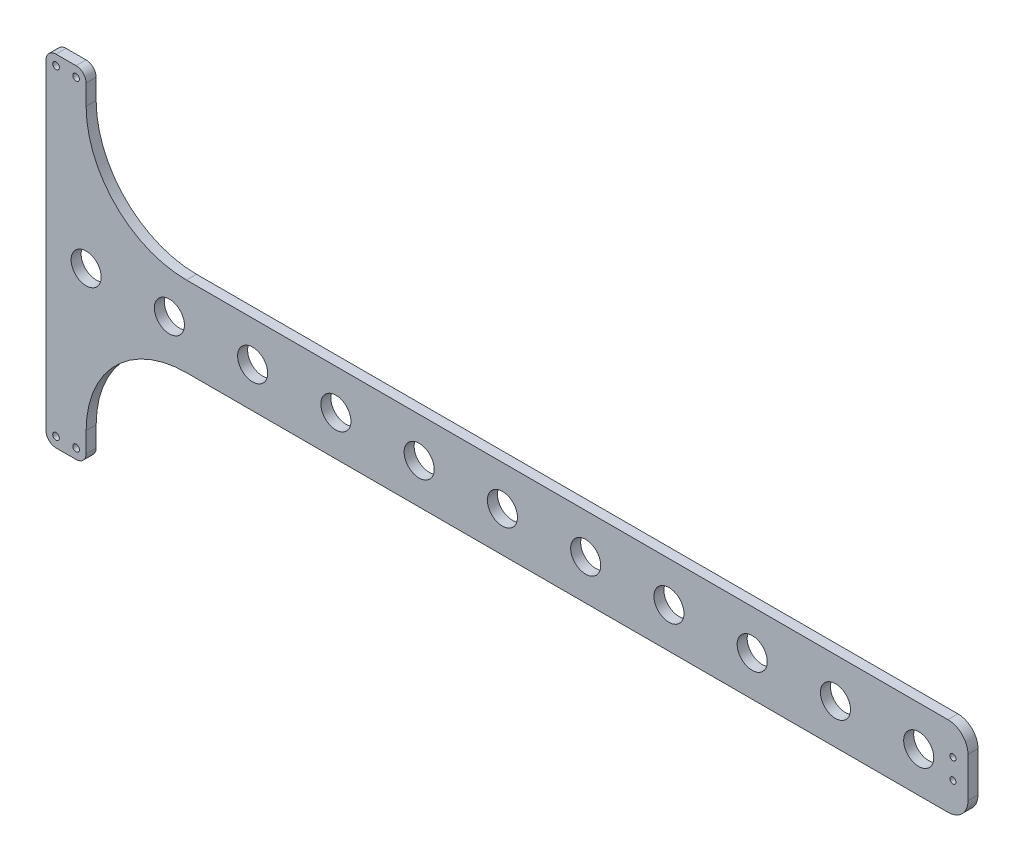
ISO-10303-21;
HEADER;
FILE_DESCRIPTION(('STEP AP214'),'2;1');
FILE_NAME('part.step','',(''),(''),'','','');
FILE_SCHEMA(('AUTOMOTIVE_DESIGN { 1 0 10303 214 1 1 1 1 }'));
ENDSEC;
DATA;
#1=APPLICATION_CONTEXT('core data for automotive mechanical design processes');
#2=APPLICATION_PROTOCOL_DEFINITION('international standard','automotive_design',2000,#1);
#3=PRODUCT_CONTEXT('',#1,'mechanical');
#4=PRODUCT('Part','Part','',(#3));
#5=PRODUCT_RELATED_PRODUCT_CATEGORY('part','',(#4));
#6=PRODUCT_DEFINITION_FORMATION('','',#4);
#7=PRODUCT_DEFINITION_CONTEXT('part definition',#1,'design');
#8=PRODUCT_DEFINITION('design','',#6,#7);
#9=PRODUCT_DEFINITION_SHAPE('','',#8);
#10=(LENGTH_UNIT() NAMED_UNIT(*) SI_UNIT(.MILLI.,.METRE.));
#11=(NAMED_UNIT(*) PLANE_ANGLE_UNIT() SI_UNIT($,.RADIAN.));
#12=(NAMED_UNIT(*) SI_UNIT($,.STERADIAN.) SOLID_ANGLE_UNIT());
#13=UNCERTAINTY_MEASURE_WITH_UNIT(LENGTH_MEASURE(1.E-05),#10,'distance_accuracy_value','');
#14=(GEOMETRIC_REPRESENTATION_CONTEXT(3) GLOBAL_UNCERTAINTY_ASSIGNED_CONTEXT((#13)) GLOBAL_UNIT_ASSIGNED_CONTEXT((#10,
#11,#12)) REPRESENTATION_CONTEXT('',''));
#15=CARTESIAN_POINT('',(0.,0.,0.));
#16=DIRECTION('',(0.,0.,1.));
#17=DIRECTION('',(1.,0.,0.));
#18=AXIS2_PLACEMENT_3D('',#15,#16,#17);
#19=CARTESIAN_POINT('',(15.,0.,5.));
#20=DIRECTION('',(1.,0.,0.));
#21=DIRECTION('',(0.,1.,0.));
#22=AXIS2_PLACEMENT_3D('',#19,#20,#21);
#23=PLANE('',#22);
#24=DIRECTION('',(0.,-1.,0.));
#25=VECTOR('',#24,1.);
#26=CARTESIAN_POINT('',(15.,0.,5.));
#27=LINE('',#26,#25);
#28=CARTESIAN_POINT('',(15.,-70.,5.));
#29=VERTEX_POINT('',#28);
#30=CARTESIAN_POINT('',(15.,-80.,5.));
#31=VERTEX_POINT('',#30);
#32=EDGE_CURVE('E295',#29,#31,#27,.T.);
#33=ORIENTED_EDGE('',*,*,#32,.T.);
#34=DIRECTION('',(0.,0.,-1.));
#35=VECTOR('',#34,1.);
#36=CARTESIAN_POINT('',(15.,-80.,0.));
#37=LINE('',#36,#35);
#38=CARTESIAN_POINT('',(15.,-80.,0.));
#39=VERTEX_POINT('',#38);
#40=EDGE_CURVE('E224',#31,#39,#37,.T.);
#41=ORIENTED_EDGE('',*,*,#40,.T.);
#42=DIRECTION('',(0.,-1.,0.));
#43=VECTOR('',#42,1.);
#44=CARTESIAN_POINT('',(15.,0.,0.));
#45=LINE('',#44,#43);
#46=CARTESIAN_POINT('',(15.,-70.,0.));
#47=VERTEX_POINT('',#46);
#48=EDGE_CURVE('E161',#47,#39,#45,.T.);
#49=ORIENTED_EDGE('',*,*,#48,.F.);
#50=DIRECTION('',(0.,0.,-1.));
#51=VECTOR('',#50,1.);
#52=CARTESIAN_POINT('',(15.,-70.,5.));
#53=LINE('',#52,#51);
#54=EDGE_CURVE('E169',#47,#29,#53,.F.);
#55=ORIENTED_EDGE('',*,*,#54,.T.);
#56=EDGE_LOOP('',(#33,#41,#49,#55));
#57=FACE_BOUND('',#56,.T.);
#58=ADVANCED_FACE('F35',(#57),#23,.T.);
#59=CARTESIAN_POINT('',(0.,-20.0000000000001,5.));
#60=DIRECTION('',(0.,-1.,0.));
#61=DIRECTION('',(1.,0.,0.));
#62=AXIS2_PLACEMENT_3D('',#59,#60,#61);
#63=PLANE('',#62);
#64=DIRECTION('',(-1.,0.,0.));
#65=VECTOR('',#64,1.);
#66=CARTESIAN_POINT('',(0.,-20.0000000000001,0.));
#67=LINE('',#66,#65);
#68=CARTESIAN_POINT('',(444.55,-20.,0.));
#69=VERTEX_POINT('',#68);
#70=CARTESIAN_POINT('',(65.,-20.0000000000001,0.));
#71=VERTEX_POINT('',#70);
#72=EDGE_CURVE('E150',#69,#71,#67,.T.);
#73=ORIENTED_EDGE('',*,*,#72,.F.);
#74=DIRECTION('',(0.,0.,-1.));
#75=VECTOR('',#74,1.);
#76=CARTESIAN_POINT('',(444.55,-20.,5.));
#77=LINE('',#76,#75);
#78=CARTESIAN_POINT('',(444.55,-20.,5.));
#79=VERTEX_POINT('',#78);
#80=EDGE_CURVE('E60',#69,#79,#77,.F.);
#81=ORIENTED_EDGE('',*,*,#80,.T.);
#82=DIRECTION('',(-1.,0.,0.));
#83=VECTOR('',#82,1.);
#84=CARTESIAN_POINT('',(0.,-20.0000000000001,5.));
#85=LINE('',#84,#83);
#86=CARTESIAN_POINT('',(65.,-20.0000000000001,5.));
#87=VERTEX_POINT('',#86);
#88=EDGE_CURVE('E174',#79,#87,#85,.T.);
#89=ORIENTED_EDGE('',*,*,#88,.T.);
#90=DIRECTION('',(0.,0.,-1.));
#91=VECTOR('',#90,1.);
#92=CARTESIAN_POINT('',(65.,-20.0000000000001,0.));
#93=LINE('',#92,#91);
#94=EDGE_CURVE('E168',#87,#71,#93,.T.);
#95=ORIENTED_EDGE('',*,*,#94,.T.);
#96=EDGE_LOOP('',(#73,#81,#89,#95));
#97=FACE_BOUND('',#96,.T.);
#98=ADVANCED_FACE('F173',(#97),#63,.T.);
#99=CARTESIAN_POINT('',(454.55,0.,5.));
#100=DIRECTION('',(1.,0.,0.));
#101=DIRECTION('',(0.,0.,-1.));
#102=AXIS2_PLACEMENT_3D('',#99,#100,#101);
#103=PLANE('',#102);
#104=DIRECTION('',(0.,-1.,0.));
#105=VECTOR('',#104,1.);
#106=CARTESIAN_POINT('',(454.55,0.,5.));
#107=LINE('',#106,#105);
#108=CARTESIAN_POINT('',(454.55,10.,5.));
#109=VERTEX_POINT('',#108);
#110=CARTESIAN_POINT('',(454.55,-10.,5.));
#111=VERTEX_POINT('',#110);
#112=EDGE_CURVE('E300',#109,#111,#107,.T.);
#113=ORIENTED_EDGE('',*,*,#112,.T.);
#114=DIRECTION('',(0.,0.,-1.));
#115=VECTOR('',#114,1.);
#116=CARTESIAN_POINT('',(454.55,-10.,5.));
#117=LINE('',#116,#115);
#118=CARTESIAN_POINT('',(454.55,-10.,0.));
#119=VERTEX_POINT('',#118);
#120=EDGE_CURVE('E243',#111,#119,#117,.T.);
#121=ORIENTED_EDGE('',*,*,#120,.T.);
#122=DIRECTION('',(0.,-1.,0.));
#123=VECTOR('',#122,1.);
#124=CARTESIAN_POINT('',(454.55,0.,0.));
#125=LINE('',#124,#123);
#126=CARTESIAN_POINT('',(454.55,10.,0.));
#127=VERTEX_POINT('',#126);
#128=EDGE_CURVE('E160',#127,#119,#125,.T.);
#129=ORIENTED_EDGE('',*,*,#128,.F.);
#130=DIRECTION('',(0.,0.,-1.));
#131=VECTOR('',#130,1.);
#132=CARTESIAN_POINT('',(454.55,10.,5.));
#133=LINE('',#132,#131);
#134=EDGE_CURVE('E234',#127,#109,#133,.F.);
#135=ORIENTED_EDGE('',*,*,#134,.T.);
#136=EDGE_LOOP('',(#113,#121,#129,#135));
#137=FACE_BOUND('',#136,.T.);
#138=ADVANCED_FACE('F369',(#137),#103,.T.);
#139=CARTESIAN_POINT('',(0.,19.9999999999999,5.));
#140=DIRECTION('',(0.,-1.,0.));
#141=DIRECTION('',(1.,0.,0.));
#142=AXIS2_PLACEMENT_3D('',#139,#140,#141);
#143=PLANE('',#142);
#144=DIRECTION('',(-1.,0.,0.));
#145=VECTOR('',#144,1.);
#146=CARTESIAN_POINT('',(0.,19.9999999999999,5.));
#147=LINE('',#146,#145);
#148=CARTESIAN_POINT('',(444.55,20.,5.));
#149=VERTEX_POINT('',#148);
#150=CARTESIAN_POINT('',(65.,19.9999999999999,5.));
#151=VERTEX_POINT('',#150);
#152=EDGE_CURVE('E303',#149,#151,#147,.T.);
#153=ORIENTED_EDGE('',*,*,#152,.F.);
#154=DIRECTION('',(0.,0.,-1.));
#155=VECTOR('',#154,1.);
#156=CARTESIAN_POINT('',(444.55,20.,0.));
#157=LINE('',#156,#155);
#158=CARTESIAN_POINT('',(444.55,20.,0.));
#159=VERTEX_POINT('',#158);
#160=EDGE_CURVE('E11',#149,#159,#157,.T.);
#161=ORIENTED_EDGE('',*,*,#160,.T.);
#162=DIRECTION('',(-1.,0.,0.));
#163=VECTOR('',#162,1.);
#164=CARTESIAN_POINT('',(0.,19.9999999999999,0.));
#165=LINE('',#164,#163);
#166=CARTESIAN_POINT('',(65.,19.9999999999999,0.));
#167=VERTEX_POINT('',#166);
#168=EDGE_CURVE('E325',#159,#167,#165,.T.);
#169=ORIENTED_EDGE('',*,*,#168,.T.);
#170=DIRECTION('',(0.,0.,-1.));
#171=VECTOR('',#170,1.);
#172=CARTESIAN_POINT('',(65.,19.9999999999999,5.));
#173=LINE('',#172,#171);
#174=EDGE_CURVE('E171',#167,#151,#173,.F.);
#175=ORIENTED_EDGE('',*,*,#174,.T.);
#176=EDGE_LOOP('',(#153,#161,#169,#175));
#177=FACE_BOUND('',#176,.T.);
#178=ADVANCED_FACE('F375',(#177),#143,.F.);
#179=CARTESIAN_POINT('',(15.,80.,0.));
#180=VERTEX_POINT('',#179);
#181=CARTESIAN_POINT('',(15.,70.,0.));
#182=VERTEX_POINT('',#181);
#183=EDGE_CURVE('E322',#180,#182,#45,.T.);
#184=ORIENTED_EDGE('',*,*,#183,.F.);
#185=DIRECTION('',(0.,0.,-1.));
#186=VECTOR('',#185,1.);
#187=CARTESIAN_POINT('',(15.,80.,5.));
#188=LINE('',#187,#186);
#189=CARTESIAN_POINT('',(15.,80.,5.));
#190=VERTEX_POINT('',#189);
#191=EDGE_CURVE('E232',#180,#190,#188,.F.);
#192=ORIENTED_EDGE('',*,*,#191,.T.);
#193=CARTESIAN_POINT('',(15.,70.,5.));
#194=VERTEX_POINT('',#193);
#195=EDGE_CURVE('E298',#190,#194,#27,.T.);
#196=ORIENTED_EDGE('',*,*,#195,.T.);
#197=DIRECTION('',(0.,0.,-1.));
#198=VECTOR('',#197,1.);
#199=CARTESIAN_POINT('',(15.,70.,5.));
#200=LINE('',#199,#198);
#201=EDGE_CURVE('E178',#194,#182,#200,.T.);
#202=ORIENTED_EDGE('',*,*,#201,.T.);
#203=EDGE_LOOP('',(#184,#192,#196,#202));
#204=FACE_BOUND('',#203,.T.);
#205=ADVANCED_FACE('F365',(#204),#23,.T.);
#206=CARTESIAN_POINT('',(0.,85.,5.));
#207=DIRECTION('',(0.,1.,0.));
#208=DIRECTION('',(0.,0.,1.));
#209=AXIS2_PLACEMENT_3D('',#206,#207,#208);
#210=PLANE('',#209);
#211=DIRECTION('',(1.,0.,0.));
#212=VECTOR('',#211,1.);
#213=CARTESIAN_POINT('',(0.,85.,0.));
#214=LINE('',#213,#212);
#215=CARTESIAN_POINT('',(0.,85.,0.));
#216=VERTEX_POINT('',#215);
#217=CARTESIAN_POINT('',(9.99999999999998,85.,0.));
#218=VERTEX_POINT('',#217);
#219=EDGE_CURVE('E327',#216,#218,#214,.T.);
#220=ORIENTED_EDGE('',*,*,#219,.F.);
#221=DIRECTION('',(0.,0.,-1.));
#222=VECTOR('',#221,1.);
#223=CARTESIAN_POINT('',(0.,85.,5.));
#224=LINE('',#223,#222);
#225=CARTESIAN_POINT('',(0.,85.,5.));
#226=VERTEX_POINT('',#225);
#227=EDGE_CURVE('E230',#216,#226,#224,.F.);
#228=ORIENTED_EDGE('',*,*,#227,.T.);
#229=DIRECTION('',(1.,0.,0.));
#230=VECTOR('',#229,1.);
#231=CARTESIAN_POINT('',(0.,85.,5.));
#232=LINE('',#231,#230);
#233=CARTESIAN_POINT('',(9.99999999999998,85.,5.));
#234=VERTEX_POINT('',#233);
#235=EDGE_CURVE('E305',#226,#234,#232,.T.);
#236=ORIENTED_EDGE('',*,*,#235,.T.);
#237=DIRECTION('',(0.,0.,-1.));
#238=VECTOR('',#237,1.);
#239=CARTESIAN_POINT('',(9.99999999999998,85.,5.));
#240=LINE('',#239,#238);
#241=EDGE_CURVE('E227',#234,#218,#240,.T.);
#242=ORIENTED_EDGE('',*,*,#241,.T.);
#243=EDGE_LOOP('',(#220,#228,#236,#242));
#244=FACE_BOUND('',#243,.T.);
#245=ADVANCED_FACE('F374',(#244),#210,.T.);
#246=CARTESIAN_POINT('',(-4.99999999999999,0.,5.));
#247=DIRECTION('',(1.,0.,0.));
#248=DIRECTION('',(0.,1.,0.));
#249=AXIS2_PLACEMENT_3D('',#246,#247,#248);
#250=PLANE('',#249);
#251=DIRECTION('',(0.,-1.,0.));
#252=VECTOR('',#251,1.);
#253=CARTESIAN_POINT('',(-4.99999999999999,0.,0.));
#254=LINE('',#253,#252);
#255=CARTESIAN_POINT('',(-5.,80.,0.));
#256=VERTEX_POINT('',#255);
#257=CARTESIAN_POINT('',(-4.99999999999998,-80.,0.));
#258=VERTEX_POINT('',#257);
#259=EDGE_CURVE('E330',#256,#258,#254,.T.);
#260=ORIENTED_EDGE('',*,*,#259,.T.);
#261=DIRECTION('',(0.,0.,-1.));
#262=VECTOR('',#261,1.);
#263=CARTESIAN_POINT('',(-4.99999999999998,-80.,5.));
#264=LINE('',#263,#262);
#265=CARTESIAN_POINT('',(-4.99999999999998,-80.,5.));
#266=VERTEX_POINT('',#265);
#267=EDGE_CURVE('E214',#258,#266,#264,.F.);
#268=ORIENTED_EDGE('',*,*,#267,.T.);
#269=DIRECTION('',(0.,-1.,0.));
#270=VECTOR('',#269,1.);
#271=CARTESIAN_POINT('',(-4.99999999999999,0.,5.));
#272=LINE('',#271,#270);
#273=CARTESIAN_POINT('',(-5.,80.,5.));
#274=VERTEX_POINT('',#273);
#275=EDGE_CURVE('E308',#274,#266,#272,.T.);
#276=ORIENTED_EDGE('',*,*,#275,.F.);
#277=DIRECTION('',(0.,0.,-1.));
#278=VECTOR('',#277,1.);
#279=CARTESIAN_POINT('',(-5.,80.,0.));
#280=LINE('',#279,#278);
#281=EDGE_CURVE('E211',#274,#256,#280,.T.);
#282=ORIENTED_EDGE('',*,*,#281,.T.);
#283=EDGE_LOOP('',(#260,#268,#276,#282));
#284=FACE_BOUND('',#283,.T.);
#285=ADVANCED_FACE('F381',(#284),#250,.F.);
#286=CARTESIAN_POINT('',(0.,80.,5.));
#287=DIRECTION('',(0.,0.,-1.));
#288=DIRECTION('',(-1.,0.,0.));
#289=AXIS2_PLACEMENT_3D('',#286,#287,#288);
#290=CYLINDRICAL_SURFACE('',#289,1.65);
#291=CARTESIAN_POINT('',(0.,80.,5.));
#292=DIRECTION('',(0.,0.,1.));
#293=DIRECTION('',(1.,0.,0.));
#294=AXIS2_PLACEMENT_3D('',#291,#292,#293);
#295=CIRCLE('',#294,1.65);
#296=CARTESIAN_POINT('',(1.65,80.,5.));
#297=VERTEX_POINT('',#296);
#298=EDGE_CURVE('E181',#297,#297,#295,.T.);
#299=ORIENTED_EDGE('',*,*,#298,.T.);
#300=EDGE_LOOP('',(#299));
#301=FACE_BOUND('',#300,.T.);
#302=CARTESIAN_POINT('',(0.,80.,0.));
#303=DIRECTION('',(0.,0.,1.));
#304=DIRECTION('',(1.,0.,0.));
#305=AXIS2_PLACEMENT_3D('',#302,#303,#304);
#306=CIRCLE('',#305,1.65);
#307=CARTESIAN_POINT('',(1.65,80.,0.));
#308=VERTEX_POINT('',#307);
#309=EDGE_CURVE('E341',#308,#308,#306,.T.);
#310=ORIENTED_EDGE('',*,*,#309,.F.);
#311=EDGE_LOOP('',(#310));
#312=FACE_BOUND('',#311,.T.);
#313=ADVANCED_FACE('F740',(#301,#312),#290,.F.);
#314=CARTESIAN_POINT('',(10.,80.,5.));
#315=DIRECTION('',(0.,0.,-1.));
#316=DIRECTION('',(-1.,0.,0.));
#317=AXIS2_PLACEMENT_3D('',#314,#315,#316);
#318=CYLINDRICAL_SURFACE('',#317,1.65);
#319=CARTESIAN_POINT('',(10.,80.,5.));
#320=DIRECTION('',(0.,0.,1.));
#321=DIRECTION('',(1.,0.,0.));
#322=AXIS2_PLACEMENT_3D('',#319,#320,#321);
#323=CIRCLE('',#322,1.65);
#324=CARTESIAN_POINT('',(11.65,80.,5.));
#325=VERTEX_POINT('',#324);
#326=EDGE_CURVE('E317',#325,#325,#323,.T.);
#327=ORIENTED_EDGE('',*,*,#326,.T.);
#328=EDGE_LOOP('',(#327));
#329=FACE_BOUND('',#328,.T.);
#330=CARTESIAN_POINT('',(10.,80.,0.));
#331=DIRECTION('',(0.,0.,1.));
#332=DIRECTION('',(1.,0.,0.));
#333=AXIS2_PLACEMENT_3D('',#330,#331,#332);
#334=CIRCLE('',#333,1.65);
#335=CARTESIAN_POINT('',(11.65,80.,0.));
#336=VERTEX_POINT('',#335);
#337=EDGE_CURVE('E339',#336,#336,#334,.T.);
#338=ORIENTED_EDGE('',*,*,#337,.F.);
#339=EDGE_LOOP('',(#338));
#340=FACE_BOUND('',#339,.T.);
#341=ADVANCED_FACE('F748',(#329,#340),#318,.F.);
#342=CARTESIAN_POINT('',(10.,-80.,5.));
#343=DIRECTION('',(0.,0.,-1.));
#344=DIRECTION('',(-1.,0.,0.));
#345=AXIS2_PLACEMENT_3D('',#342,#343,#344);
#346=CYLINDRICAL_SURFACE('',#345,1.65);
#347=CARTESIAN_POINT('',(10.,-80.,5.));
#348=DIRECTION('',(0.,0.,1.));
#349=DIRECTION('',(1.,0.,0.));
#350=AXIS2_PLACEMENT_3D('',#347,#348,#349);
#351=CIRCLE('',#350,1.65);
#352=CARTESIAN_POINT('',(11.65,-80.,5.));
#353=VERTEX_POINT('',#352);
#354=EDGE_CURVE('E314',#353,#353,#351,.F.);
#355=ORIENTED_EDGE('',*,*,#354,.F.);
#356=EDGE_LOOP('',(#355));
#357=FACE_BOUND('',#356,.T.);
#358=CARTESIAN_POINT('',(10.,-80.,0.));
#359=DIRECTION('',(0.,0.,1.));
#360=DIRECTION('',(1.,0.,0.));
#361=AXIS2_PLACEMENT_3D('',#358,#359,#360);
#362=CIRCLE('',#361,1.65);
#363=CARTESIAN_POINT('',(11.65,-80.,0.));
#364=VERTEX_POINT('',#363);
#365=EDGE_CURVE('E336',#364,#364,#362,.F.);
#366=ORIENTED_EDGE('',*,*,#365,.T.);
#367=EDGE_LOOP('',(#366));
#368=FACE_BOUND('',#367,.T.);
#369=ADVANCED_FACE('F757',(#357,#368),#346,.F.);
#370=CARTESIAN_POINT('',(0.,-85.,5.));
#371=DIRECTION('',(0.,1.,0.));
#372=DIRECTION('',(0.,0.,1.));
#373=AXIS2_PLACEMENT_3D('',#370,#371,#372);
#374=PLANE('',#373);
#375=DIRECTION('',(1.,0.,0.));
#376=VECTOR('',#375,1.);
#377=CARTESIAN_POINT('',(0.,-85.,5.));
#378=LINE('',#377,#376);
#379=CARTESIAN_POINT('',(0.,-85.,5.));
#380=VERTEX_POINT('',#379);
#381=CARTESIAN_POINT('',(10.,-85.,5.));
#382=VERTEX_POINT('',#381);
#383=EDGE_CURVE('E311',#380,#382,#378,.T.);
#384=ORIENTED_EDGE('',*,*,#383,.F.);
#385=DIRECTION('',(0.,0.,-1.));
#386=VECTOR('',#385,1.);
#387=CARTESIAN_POINT('',(0.,-85.,5.));
#388=LINE('',#387,#386);
#389=CARTESIAN_POINT('',(0.,-85.,0.));
#390=VERTEX_POINT('',#389);
#391=EDGE_CURVE('E200',#380,#390,#388,.T.);
#392=ORIENTED_EDGE('',*,*,#391,.T.);
#393=DIRECTION('',(1.,0.,0.));
#394=VECTOR('',#393,1.);
#395=CARTESIAN_POINT('',(0.,-85.,0.));
#396=LINE('',#395,#394);
#397=CARTESIAN_POINT('',(10.,-85.,0.));
#398=VERTEX_POINT('',#397);
#399=EDGE_CURVE('E333',#390,#398,#396,.T.);
#400=ORIENTED_EDGE('',*,*,#399,.T.);
#401=DIRECTION('',(0.,0.,-1.));
#402=VECTOR('',#401,1.);
#403=CARTESIAN_POINT('',(10.,-85.,5.));
#404=LINE('',#403,#402);
#405=EDGE_CURVE('E198',#398,#382,#404,.F.);
#406=ORIENTED_EDGE('',*,*,#405,.T.);
#407=EDGE_LOOP('',(#384,#392,#400,#406));
#408=FACE_BOUND('',#407,.T.);
#409=ADVANCED_FACE('F412',(#408),#374,.F.);
#410=CARTESIAN_POINT('',(0.,-80.,5.));
#411=DIRECTION('',(0.,0.,-1.));
#412=DIRECTION('',(-1.,0.,0.));
#413=AXIS2_PLACEMENT_3D('',#410,#411,#412);
#414=CYLINDRICAL_SURFACE('',#413,1.65);
#415=CARTESIAN_POINT('',(0.,-80.,5.));
#416=DIRECTION('',(0.,0.,1.));
#417=DIRECTION('',(1.,0.,0.));
#418=AXIS2_PLACEMENT_3D('',#415,#416,#417);
#419=CIRCLE('',#418,1.65);
#420=CARTESIAN_POINT('',(1.65,-80.,5.));
#421=VERTEX_POINT('',#420);
#422=EDGE_CURVE('E176',#421,#421,#419,.F.);
#423=ORIENTED_EDGE('',*,*,#422,.F.);
#424=EDGE_LOOP('',(#423));
#425=FACE_BOUND('',#424,.T.);
#426=CARTESIAN_POINT('',(0.,-80.,0.));
#427=DIRECTION('',(0.,0.,1.));
#428=DIRECTION('',(1.,0.,0.));
#429=AXIS2_PLACEMENT_3D('',#426,#427,#428);
#430=CIRCLE('',#429,1.65);
#431=CARTESIAN_POINT('',(1.65,-80.,0.));
#432=VERTEX_POINT('',#431);
#433=EDGE_CURVE('E184',#432,#432,#430,.F.);
#434=ORIENTED_EDGE('',*,*,#433,.T.);
#435=EDGE_LOOP('',(#434));
#436=FACE_BOUND('',#435,.T.);
#437=ADVANCED_FACE('F348',(#425,#436),#414,.F.);
#438=CARTESIAN_POINT('',(0.,0.,5.));
#439=DIRECTION('',(0.,0.,1.));
#440=DIRECTION('',(1.,0.,0.));
#441=AXIS2_PLACEMENT_3D('',#438,#439,#440);
#442=PLANE('',#441);
#443=CARTESIAN_POINT('',(15.,0.,5.));
#444=DIRECTION('',(0.,0.,1.));
#445=DIRECTION('',(1.,0.,0.));
#446=AXIS2_PLACEMENT_3D('',#443,#444,#445);
#447=CIRCLE('',#446,7.5);
#448=CARTESIAN_POINT('',(22.5,0.,5.));
#449=VERTEX_POINT('',#448);
#450=EDGE_CURVE('E256',#449,#449,#447,.T.);
#451=ORIENTED_EDGE('',*,*,#450,.F.);
#452=EDGE_LOOP('',(#451));
#453=FACE_BOUND('',#452,.T.);
#454=CARTESIAN_POINT('',(56.5,0.,5.));
#455=DIRECTION('',(0.,0.,1.));
#456=DIRECTION('',(1.,0.,0.));
#457=AXIS2_PLACEMENT_3D('',#454,#455,#456);
#458=CIRCLE('',#457,7.50000000000002);
#459=CARTESIAN_POINT('',(64.,0.,5.));
#460=VERTEX_POINT('',#459);
#461=EDGE_CURVE('E507',#460,#460,#458,.T.);
#462=ORIENTED_EDGE('',*,*,#461,.F.);
#463=EDGE_LOOP('',(#462));
#464=FACE_BOUND('',#463,.T.);
#465=CARTESIAN_POINT('',(98.,0.,5.));
#466=DIRECTION('',(0.,0.,1.));
#467=DIRECTION('',(1.,0.,0.));
#468=AXIS2_PLACEMENT_3D('',#465,#466,#467);
#469=CIRCLE('',#468,7.5);
#470=CARTESIAN_POINT('',(105.5,0.,5.));
#471=VERTEX_POINT('',#470);
#472=EDGE_CURVE('E510',#471,#471,#469,.T.);
#473=ORIENTED_EDGE('',*,*,#472,.F.);
#474=EDGE_LOOP('',(#473));
#475=FACE_BOUND('',#474,.T.);
#476=CARTESIAN_POINT('',(139.5,0.,5.));
#477=DIRECTION('',(0.,0.,1.));
#478=DIRECTION('',(1.,0.,0.));
#479=AXIS2_PLACEMENT_3D('',#476,#477,#478);
#480=CIRCLE('',#479,7.50000000000001);
#481=CARTESIAN_POINT('',(147.,0.,5.));
#482=VERTEX_POINT('',#481);
#483=EDGE_CURVE('E515',#482,#482,#480,.T.);
#484=ORIENTED_EDGE('',*,*,#483,.F.);
#485=EDGE_LOOP('',(#484));
#486=FACE_BOUND('',#485,.T.);
#487=CARTESIAN_POINT('',(181.,0.,5.));
#488=DIRECTION('',(0.,0.,1.));
#489=DIRECTION('',(1.,0.,0.));
#490=AXIS2_PLACEMENT_3D('',#487,#488,#489);
#491=CIRCLE('',#490,7.49999999999998);
#492=CARTESIAN_POINT('',(188.5,0.,5.));
#493=VERTEX_POINT('',#492);
#494=EDGE_CURVE('E518',#493,#493,#491,.T.);
#495=ORIENTED_EDGE('',*,*,#494,.F.);
#496=EDGE_LOOP('',(#495));
#497=FACE_BOUND('',#496,.T.);
#498=CARTESIAN_POINT('',(222.5,0.,5.));
#499=DIRECTION('',(0.,0.,1.));
#500=DIRECTION('',(1.,0.,0.));
#501=AXIS2_PLACEMENT_3D('',#498,#499,#500);
#502=CIRCLE('',#501,7.50000000000001);
#503=CARTESIAN_POINT('',(230.,0.,5.));
#504=VERTEX_POINT('',#503);
#505=EDGE_CURVE('E521',#504,#504,#502,.T.);
#506=ORIENTED_EDGE('',*,*,#505,.F.);
#507=EDGE_LOOP('',(#506));
#508=FACE_BOUND('',#507,.T.);
#509=CARTESIAN_POINT('',(264.,0.,5.));
#510=DIRECTION('',(0.,0.,1.));
#511=DIRECTION('',(1.,0.,0.));
#512=AXIS2_PLACEMENT_3D('',#509,#510,#511);
#513=CIRCLE('',#512,7.50000000000001);
#514=CARTESIAN_POINT('',(271.5,0.,5.));
#515=VERTEX_POINT('',#514);
#516=EDGE_CURVE('E524',#515,#515,#513,.T.);
#517=ORIENTED_EDGE('',*,*,#516,.F.);
#518=EDGE_LOOP('',(#517));
#519=FACE_BOUND('',#518,.T.);
#520=CARTESIAN_POINT('',(305.5,0.,5.));
#521=DIRECTION('',(0.,0.,1.));
#522=DIRECTION('',(1.,0.,0.));
#523=AXIS2_PLACEMENT_3D('',#520,#521,#522);
#524=CIRCLE('',#523,7.50000000000001);
#525=CARTESIAN_POINT('',(313.,0.,5.));
#526=VERTEX_POINT('',#525);
#527=EDGE_CURVE('E527',#526,#526,#524,.T.);
#528=ORIENTED_EDGE('',*,*,#527,.F.);
#529=EDGE_LOOP('',(#528));
#530=FACE_BOUND('',#529,.T.);
#531=CARTESIAN_POINT('',(347.,0.,5.));
#532=DIRECTION('',(0.,0.,1.));
#533=DIRECTION('',(1.,0.,0.));
#534=AXIS2_PLACEMENT_3D('',#531,#532,#533);
#535=CIRCLE('',#534,7.50000000000001);
#536=CARTESIAN_POINT('',(354.5,0.,5.));
#537=VERTEX_POINT('',#536);
#538=EDGE_CURVE('E530',#537,#537,#535,.T.);
#539=ORIENTED_EDGE('',*,*,#538,.F.);
#540=EDGE_LOOP('',(#539));
#541=FACE_BOUND('',#540,.T.);
#542=CARTESIAN_POINT('',(388.5,0.,5.));
#543=DIRECTION('',(0.,0.,1.));
#544=DIRECTION('',(1.,0.,0.));
#545=AXIS2_PLACEMENT_3D('',#542,#543,#544);
#546=CIRCLE('',#545,7.50000000000001);
#547=CARTESIAN_POINT('',(396.,0.,5.));
#548=VERTEX_POINT('',#547);
#549=EDGE_CURVE('E533',#548,#548,#546,.T.);
#550=ORIENTED_EDGE('',*,*,#549,.F.);
#551=EDGE_LOOP('',(#550));
#552=FACE_BOUND('',#551,.T.);
#553=CARTESIAN_POINT('',(430.,0.,5.));
#554=DIRECTION('',(0.,0.,1.));
#555=DIRECTION('',(1.,0.,0.));
#556=AXIS2_PLACEMENT_3D('',#553,#554,#555);
#557=CIRCLE('',#556,7.50000000000001);
#558=CARTESIAN_POINT('',(437.5,0.,5.));
#559=VERTEX_POINT('',#558);
#560=EDGE_CURVE('E535',#559,#559,#557,.T.);
#561=ORIENTED_EDGE('',*,*,#560,.F.);
#562=EDGE_LOOP('',(#561));
#563=FACE_BOUND('',#562,.T.);
#564=CARTESIAN_POINT('',(447.05,5.,5.));
#565=DIRECTION('',(0.,0.,1.));
#566=DIRECTION('',(1.,0.,0.));
#567=AXIS2_PLACEMENT_3D('',#564,#565,#566);
#568=CIRCLE('',#567,1.50000000000002);
#569=CARTESIAN_POINT('',(448.55,5.,5.));
#570=VERTEX_POINT('',#569);
#571=EDGE_CURVE('E239',#570,#570,#568,.T.);
#572=ORIENTED_EDGE('',*,*,#571,.F.);
#573=EDGE_LOOP('',(#572));
#574=FACE_BOUND('',#573,.T.);
#575=CARTESIAN_POINT('',(447.05,-5.,5.));
#576=DIRECTION('',(0.,0.,1.));
#577=DIRECTION('',(-1.,0.,0.));
#578=AXIS2_PLACEMENT_3D('',#575,#576,#577);
#579=CIRCLE('',#578,1.50000000000002);
#580=CARTESIAN_POINT('',(445.55,-5.,5.));
#581=VERTEX_POINT('',#580);
#582=EDGE_CURVE('E284',#581,#581,#579,.T.);
#583=ORIENTED_EDGE('',*,*,#582,.F.);
#584=EDGE_LOOP('',(#583));
#585=FACE_BOUND('',#584,.T.);
#586=ORIENTED_EDGE('',*,*,#88,.F.);
#587=CARTESIAN_POINT('',(444.55,-10.,5.));
#588=DIRECTION('',(0.,0.,1.));
#589=DIRECTION('',(1.,0.,0.));
#590=AXIS2_PLACEMENT_3D('',#587,#588,#589);
#591=CIRCLE('',#590,10.);
#592=EDGE_CURVE('E44',#79,#111,#591,.T.);
#593=ORIENTED_EDGE('',*,*,#592,.T.);
#594=ORIENTED_EDGE('',*,*,#112,.F.);
#595=CARTESIAN_POINT('',(444.55,10.,5.));
#596=DIRECTION('',(0.,0.,1.));
#597=DIRECTION('',(1.,0.,0.));
#598=AXIS2_PLACEMENT_3D('',#595,#596,#597);
#599=CIRCLE('',#598,10.);
#600=EDGE_CURVE('E52',#109,#149,#599,.T.);
#601=ORIENTED_EDGE('',*,*,#600,.T.);
#602=ORIENTED_EDGE('',*,*,#152,.T.);
#603=CARTESIAN_POINT('',(65.,70.,5.));
#604=DIRECTION('',(0.,0.,1.));
#605=DIRECTION('',(1.,0.,0.));
#606=AXIS2_PLACEMENT_3D('',#603,#604,#605);
#607=CIRCLE('',#606,50.);
#608=EDGE_CURVE('E195',#151,#194,#607,.F.);
#609=ORIENTED_EDGE('',*,*,#608,.T.);
#610=ORIENTED_EDGE('',*,*,#195,.F.);
#611=CARTESIAN_POINT('',(9.99999999999998,80.,5.));
#612=DIRECTION('',(0.,0.,1.));
#613=DIRECTION('',(1.,0.,0.));
#614=AXIS2_PLACEMENT_3D('',#611,#612,#613);
#615=CIRCLE('',#614,5.);
#616=EDGE_CURVE('E216',#190,#234,#615,.T.);
#617=ORIENTED_EDGE('',*,*,#616,.T.);
#618=ORIENTED_EDGE('',*,*,#235,.F.);
#619=CARTESIAN_POINT('',(0.,80.,5.));
#620=DIRECTION('',(0.,0.,1.));
#621=DIRECTION('',(1.,0.,0.));
#622=AXIS2_PLACEMENT_3D('',#619,#620,#621);
#623=CIRCLE('',#622,5.);
#624=EDGE_CURVE('E218',#226,#274,#623,.T.);
#625=ORIENTED_EDGE('',*,*,#624,.T.);
#626=ORIENTED_EDGE('',*,*,#275,.T.);
#627=CARTESIAN_POINT('',(0.,-80.,5.));
#628=DIRECTION('',(0.,0.,1.));
#629=DIRECTION('',(1.,0.,0.));
#630=AXIS2_PLACEMENT_3D('',#627,#628,#629);
#631=CIRCLE('',#630,5.);
#632=EDGE_CURVE('E222',#266,#380,#631,.T.);
#633=ORIENTED_EDGE('',*,*,#632,.T.);
#634=ORIENTED_EDGE('',*,*,#383,.T.);
#635=CARTESIAN_POINT('',(10.,-80.,5.));
#636=DIRECTION('',(0.,0.,1.));
#637=DIRECTION('',(1.,0.,0.));
#638=AXIS2_PLACEMENT_3D('',#635,#636,#637);
#639=CIRCLE('',#638,5.);
#640=EDGE_CURVE('E220',#382,#31,#639,.T.);
#641=ORIENTED_EDGE('',*,*,#640,.T.);
#642=ORIENTED_EDGE('',*,*,#32,.F.);
#643=CARTESIAN_POINT('',(65.,-70.,5.));
#644=DIRECTION('',(0.,0.,1.));
#645=DIRECTION('',(1.,0.,0.));
#646=AXIS2_PLACEMENT_3D('',#643,#644,#645);
#647=CIRCLE('',#646,50.);
#648=EDGE_CURVE('E170',#29,#87,#647,.F.);
#649=ORIENTED_EDGE('',*,*,#648,.T.);
#650=EDGE_LOOP('',(#586,#593,#594,#601,#602,#609,#610,#617,#618,#625,#626,#633,#634,#641,#642,#649));
#651=FACE_BOUND('',#650,.T.);
#652=ORIENTED_EDGE('',*,*,#354,.T.);
#653=EDGE_LOOP('',(#652));
#654=FACE_BOUND('',#653,.T.);
#655=ORIENTED_EDGE('',*,*,#326,.F.);
#656=EDGE_LOOP('',(#655));
#657=FACE_BOUND('',#656,.T.);
#658=ORIENTED_EDGE('',*,*,#298,.F.);
#659=EDGE_LOOP('',(#658));
#660=FACE_BOUND('',#659,.T.);
#661=ORIENTED_EDGE('',*,*,#422,.T.);
#662=EDGE_LOOP('',(#661));
#663=FACE_BOUND('',#662,.T.);
#664=ADVANCED_FACE('F351',(#453,#464,#475,#486,#497,#508,#519,#530,#541,#552,#563,#574,#585,
#651,#654,#657,#660,#663),#442,.T.);
#665=CARTESIAN_POINT('',(0.,0.,0.));
#666=DIRECTION('',(0.,0.,1.));
#667=DIRECTION('',(1.,0.,0.));
#668=AXIS2_PLACEMENT_3D('',#665,#666,#667);
#669=PLANE('',#668);
#670=CARTESIAN_POINT('',(15.,0.,0.));
#671=DIRECTION('',(0.,0.,1.));
#672=DIRECTION('',(1.,0.,0.));
#673=AXIS2_PLACEMENT_3D('',#670,#671,#672);
#674=CIRCLE('',#673,7.5);
#675=CARTESIAN_POINT('',(22.5,0.,0.));
#676=VERTEX_POINT('',#675);
#677=EDGE_CURVE('E39',#676,#676,#674,.T.);
#678=ORIENTED_EDGE('',*,*,#677,.T.);
#679=EDGE_LOOP('',(#678));
#680=FACE_BOUND('',#679,.T.);
#681=CARTESIAN_POINT('',(56.5,0.,0.));
#682=DIRECTION('',(0.,0.,1.));
#683=DIRECTION('',(1.,0.,0.));
#684=AXIS2_PLACEMENT_3D('',#681,#682,#683);
#685=CIRCLE('',#684,7.50000000000002);
#686=CARTESIAN_POINT('',(64.,0.,0.));
#687=VERTEX_POINT('',#686);
#688=EDGE_CURVE('E279',#687,#687,#685,.T.);
#689=ORIENTED_EDGE('',*,*,#688,.T.);
#690=EDGE_LOOP('',(#689));
#691=FACE_BOUND('',#690,.T.);
#692=CARTESIAN_POINT('',(98.,0.,0.));
#693=DIRECTION('',(0.,0.,1.));
#694=DIRECTION('',(1.,0.,0.));
#695=AXIS2_PLACEMENT_3D('',#692,#693,#694);
#696=CIRCLE('',#695,7.5);
#697=CARTESIAN_POINT('',(105.5,0.,0.));
#698=VERTEX_POINT('',#697);
#699=EDGE_CURVE('E277',#698,#698,#696,.T.);
#700=ORIENTED_EDGE('',*,*,#699,.T.);
#701=EDGE_LOOP('',(#700));
#702=FACE_BOUND('',#701,.T.);
#703=CARTESIAN_POINT('',(139.5,0.,0.));
#704=DIRECTION('',(0.,0.,1.));
#705=DIRECTION('',(1.,0.,0.));
#706=AXIS2_PLACEMENT_3D('',#703,#704,#705);
#707=CIRCLE('',#706,7.50000000000001);
#708=CARTESIAN_POINT('',(147.,0.,0.));
#709=VERTEX_POINT('',#708);
#710=EDGE_CURVE('E274',#709,#709,#707,.T.);
#711=ORIENTED_EDGE('',*,*,#710,.T.);
#712=EDGE_LOOP('',(#711));
#713=FACE_BOUND('',#712,.T.);
#714=CARTESIAN_POINT('',(181.,0.,0.));
#715=DIRECTION('',(0.,0.,1.));
#716=DIRECTION('',(1.,0.,0.));
#717=AXIS2_PLACEMENT_3D('',#714,#715,#716);
#718=CIRCLE('',#717,7.49999999999998);
#719=CARTESIAN_POINT('',(188.5,0.,0.));
#720=VERTEX_POINT('',#719);
#721=EDGE_CURVE('E271',#720,#720,#718,.T.);
#722=ORIENTED_EDGE('',*,*,#721,.T.);
#723=EDGE_LOOP('',(#722));
#724=FACE_BOUND('',#723,.T.);
#725=CARTESIAN_POINT('',(222.5,0.,0.));
#726=DIRECTION('',(0.,0.,1.));
#727=DIRECTION('',(1.,0.,0.));
#728=AXIS2_PLACEMENT_3D('',#725,#726,#727);
#729=CIRCLE('',#728,7.50000000000001);
#730=CARTESIAN_POINT('',(230.,0.,0.));
#731=VERTEX_POINT('',#730);
#732=EDGE_CURVE('E268',#731,#731,#729,.T.);
#733=ORIENTED_EDGE('',*,*,#732,.T.);
#734=EDGE_LOOP('',(#733));
#735=FACE_BOUND('',#734,.T.);
#736=CARTESIAN_POINT('',(264.,0.,0.));
#737=DIRECTION('',(0.,0.,1.));
#738=DIRECTION('',(1.,0.,0.));
#739=AXIS2_PLACEMENT_3D('',#736,#737,#738);
#740=CIRCLE('',#739,7.50000000000001);
#741=CARTESIAN_POINT('',(271.5,0.,0.));
#742=VERTEX_POINT('',#741);
#743=EDGE_CURVE('E265',#742,#742,#740,.T.);
#744=ORIENTED_EDGE('',*,*,#743,.T.);
#745=EDGE_LOOP('',(#744));
#746=FACE_BOUND('',#745,.T.);
#747=CARTESIAN_POINT('',(305.5,0.,0.));
#748=DIRECTION('',(0.,0.,1.));
#749=DIRECTION('',(1.,0.,0.));
#750=AXIS2_PLACEMENT_3D('',#747,#748,#749);
#751=CIRCLE('',#750,7.50000000000001);
#752=CARTESIAN_POINT('',(313.,0.,0.));
#753=VERTEX_POINT('',#752);
#754=EDGE_CURVE('E262',#753,#753,#751,.T.);
#755=ORIENTED_EDGE('',*,*,#754,.T.);
#756=EDGE_LOOP('',(#755));
#757=FACE_BOUND('',#756,.T.);
#758=CARTESIAN_POINT('',(347.,0.,0.));
#759=DIRECTION('',(0.,0.,1.));
#760=DIRECTION('',(1.,0.,0.));
#761=AXIS2_PLACEMENT_3D('',#758,#759,#760);
#762=CIRCLE('',#761,7.50000000000001);
#763=CARTESIAN_POINT('',(354.5,0.,0.));
#764=VERTEX_POINT('',#763);
#765=EDGE_CURVE('E259',#764,#764,#762,.T.);
#766=ORIENTED_EDGE('',*,*,#765,.T.);
#767=EDGE_LOOP('',(#766));
#768=FACE_BOUND('',#767,.T.);
#769=CARTESIAN_POINT('',(388.5,0.,0.));
#770=DIRECTION('',(0.,0.,1.));
#771=DIRECTION('',(1.,0.,0.));
#772=AXIS2_PLACEMENT_3D('',#769,#770,#771);
#773=CIRCLE('',#772,7.50000000000001);
#774=CARTESIAN_POINT('',(396.,0.,0.));
#775=VERTEX_POINT('',#774);
#776=EDGE_CURVE('E255',#775,#775,#773,.T.);
#777=ORIENTED_EDGE('',*,*,#776,.T.);
#778=EDGE_LOOP('',(#777));
#779=FACE_BOUND('',#778,.T.);
#780=CARTESIAN_POINT('',(430.,0.,0.));
#781=DIRECTION('',(0.,0.,1.));
#782=DIRECTION('',(1.,0.,0.));
#783=AXIS2_PLACEMENT_3D('',#780,#781,#782);
#784=CIRCLE('',#783,7.50000000000001);
#785=CARTESIAN_POINT('',(437.5,0.,0.));
#786=VERTEX_POINT('',#785);
#787=EDGE_CURVE('E252',#786,#786,#784,.T.);
#788=ORIENTED_EDGE('',*,*,#787,.T.);
#789=EDGE_LOOP('',(#788));
#790=FACE_BOUND('',#789,.T.);
#791=CARTESIAN_POINT('',(447.05,5.,0.));
#792=DIRECTION('',(0.,0.,1.));
#793=DIRECTION('',(1.,0.,0.));
#794=AXIS2_PLACEMENT_3D('',#791,#792,#793);
#795=CIRCLE('',#794,1.50000000000002);
#796=CARTESIAN_POINT('',(448.55,5.,0.));
#797=VERTEX_POINT('',#796);
#798=EDGE_CURVE('E238',#797,#797,#795,.T.);
#799=ORIENTED_EDGE('',*,*,#798,.T.);
#800=EDGE_LOOP('',(#799));
#801=FACE_BOUND('',#800,.T.);
#802=CARTESIAN_POINT('',(447.05,-5.,0.));
#803=DIRECTION('',(0.,0.,1.));
#804=DIRECTION('',(1.,0.,0.));
#805=AXIS2_PLACEMENT_3D('',#802,#803,#804);
#806=CIRCLE('',#805,1.50000000000002);
#807=CARTESIAN_POINT('',(448.55,-5.,0.));
#808=VERTEX_POINT('',#807);
#809=EDGE_CURVE('E235',#808,#808,#806,.T.);
#810=ORIENTED_EDGE('',*,*,#809,.T.);
#811=EDGE_LOOP('',(#810));
#812=FACE_BOUND('',#811,.T.);
#813=ORIENTED_EDGE('',*,*,#128,.T.);
#814=CARTESIAN_POINT('',(444.55,-10.,0.));
#815=DIRECTION('',(0.,0.,1.));
#816=DIRECTION('',(1.,0.,0.));
#817=AXIS2_PLACEMENT_3D('',#814,#815,#816);
#818=CIRCLE('',#817,10.);
#819=EDGE_CURVE('E158',#119,#69,#818,.F.);
#820=ORIENTED_EDGE('',*,*,#819,.T.);
#821=ORIENTED_EDGE('',*,*,#72,.T.);
#822=CARTESIAN_POINT('',(65.,-70.,0.));
#823=DIRECTION('',(0.,0.,1.));
#824=DIRECTION('',(1.,0.,0.));
#825=AXIS2_PLACEMENT_3D('',#822,#823,#824);
#826=CIRCLE('',#825,50.);
#827=EDGE_CURVE('E156',#71,#47,#826,.T.);
#828=ORIENTED_EDGE('',*,*,#827,.T.);
#829=ORIENTED_EDGE('',*,*,#48,.T.);
#830=CARTESIAN_POINT('',(10.,-80.,0.));
#831=DIRECTION('',(0.,0.,1.));
#832=DIRECTION('',(1.,0.,0.));
#833=AXIS2_PLACEMENT_3D('',#830,#831,#832);
#834=CIRCLE('',#833,5.);
#835=EDGE_CURVE('E207',#39,#398,#834,.F.);
#836=ORIENTED_EDGE('',*,*,#835,.T.);
#837=ORIENTED_EDGE('',*,*,#399,.F.);
#838=CARTESIAN_POINT('',(0.,-80.,0.));
#839=DIRECTION('',(0.,0.,1.));
#840=DIRECTION('',(1.,0.,0.));
#841=AXIS2_PLACEMENT_3D('',#838,#839,#840);
#842=CIRCLE('',#841,5.);
#843=EDGE_CURVE('E209',#390,#258,#842,.F.);
#844=ORIENTED_EDGE('',*,*,#843,.T.);
#845=ORIENTED_EDGE('',*,*,#259,.F.);
#846=CARTESIAN_POINT('',(0.,80.,0.));
#847=DIRECTION('',(0.,0.,1.));
#848=DIRECTION('',(1.,0.,0.));
#849=AXIS2_PLACEMENT_3D('',#846,#847,#848);
#850=CIRCLE('',#849,5.);
#851=EDGE_CURVE('E205',#256,#216,#850,.F.);
#852=ORIENTED_EDGE('',*,*,#851,.T.);
#853=ORIENTED_EDGE('',*,*,#219,.T.);
#854=CARTESIAN_POINT('',(9.99999999999998,80.,0.));
#855=DIRECTION('',(0.,0.,1.));
#856=DIRECTION('',(1.,0.,0.));
#857=AXIS2_PLACEMENT_3D('',#854,#855,#856);
#858=CIRCLE('',#857,5.);
#859=EDGE_CURVE('E203',#218,#180,#858,.F.);
#860=ORIENTED_EDGE('',*,*,#859,.T.);
#861=ORIENTED_EDGE('',*,*,#183,.T.);
#862=CARTESIAN_POINT('',(65.,70.,0.));
#863=DIRECTION('',(0.,0.,1.));
#864=DIRECTION('',(1.,0.,0.));
#865=AXIS2_PLACEMENT_3D('',#862,#863,#864);
#866=CIRCLE('',#865,50.);
#867=EDGE_CURVE('E192',#182,#167,#866,.T.);
#868=ORIENTED_EDGE('',*,*,#867,.T.);
#869=ORIENTED_EDGE('',*,*,#168,.F.);
#870=CARTESIAN_POINT('',(444.55,10.,0.));
#871=DIRECTION('',(0.,0.,1.));
#872=DIRECTION('',(1.,0.,0.));
#873=AXIS2_PLACEMENT_3D('',#870,#871,#872);
#874=CIRCLE('',#873,10.);
#875=EDGE_CURVE('E246',#159,#127,#874,.F.);
#876=ORIENTED_EDGE('',*,*,#875,.T.);
#877=EDGE_LOOP('',(#813,#820,#821,#828,#829,#836,#837,#844,#845,#852,#853,#860,#861,#868,#869,#876));
#878=FACE_BOUND('',#877,.T.);
#879=ORIENTED_EDGE('',*,*,#365,.F.);
#880=EDGE_LOOP('',(#879));
#881=FACE_BOUND('',#880,.T.);
#882=ORIENTED_EDGE('',*,*,#337,.T.);
#883=EDGE_LOOP('',(#882));
#884=FACE_BOUND('',#883,.T.);
#885=ORIENTED_EDGE('',*,*,#309,.T.);
#886=EDGE_LOOP('',(#885));
#887=FACE_BOUND('',#886,.T.);
#888=ORIENTED_EDGE('',*,*,#433,.F.);
#889=EDGE_LOOP('',(#888));
#890=FACE_BOUND('',#889,.T.);
#891=ADVANCED_FACE('F153',(#680,#691,#702,#713,#724,#735,#746,#757,#768,#779,#790,#801,#812,
#878,#881,#884,#887,#890),#669,.F.);
#892=CARTESIAN_POINT('',(65.,-70.,5.));
#893=DIRECTION('',(0.,0.,1.));
#894=DIRECTION('',(1.,0.,0.));
#895=AXIS2_PLACEMENT_3D('',#892,#893,#894);
#896=CYLINDRICAL_SURFACE('',#895,50.);
#897=ORIENTED_EDGE('',*,*,#648,.F.);
#898=ORIENTED_EDGE('',*,*,#54,.F.);
#899=ORIENTED_EDGE('',*,*,#827,.F.);
#900=ORIENTED_EDGE('',*,*,#94,.F.);
#901=EDGE_LOOP('',(#897,#898,#899,#900));
#902=FACE_BOUND('',#901,.T.);
#903=ADVANCED_FACE('F167',(#902),#896,.F.);
#904=CARTESIAN_POINT('',(65.,70.,5.));
#905=DIRECTION('',(0.,0.,-1.));
#906=DIRECTION('',(-1.,0.,0.));
#907=AXIS2_PLACEMENT_3D('',#904,#905,#906);
#908=CYLINDRICAL_SURFACE('',#907,50.);
#909=ORIENTED_EDGE('',*,*,#608,.F.);
#910=ORIENTED_EDGE('',*,*,#174,.F.);
#911=ORIENTED_EDGE('',*,*,#867,.F.);
#912=ORIENTED_EDGE('',*,*,#201,.F.);
#913=EDGE_LOOP('',(#909,#910,#911,#912));
#914=FACE_BOUND('',#913,.T.);
#915=ADVANCED_FACE('F357',(#914),#908,.F.);
#916=CARTESIAN_POINT('',(0.,-80.,5.));
#917=DIRECTION('',(0.,0.,-1.));
#918=DIRECTION('',(-1.,0.,0.));
#919=AXIS2_PLACEMENT_3D('',#916,#917,#918);
#920=CYLINDRICAL_SURFACE('',#919,5.);
#921=ORIENTED_EDGE('',*,*,#632,.F.);
#922=ORIENTED_EDGE('',*,*,#267,.F.);
#923=ORIENTED_EDGE('',*,*,#843,.F.);
#924=ORIENTED_EDGE('',*,*,#391,.F.);
#925=EDGE_LOOP('',(#921,#922,#923,#924));
#926=FACE_BOUND('',#925,.T.);
#927=ADVANCED_FACE('F407',(#926),#920,.T.);
#928=CARTESIAN_POINT('',(10.,-80.,5.));
#929=DIRECTION('',(0.,0.,1.));
#930=DIRECTION('',(1.,0.,0.));
#931=AXIS2_PLACEMENT_3D('',#928,#929,#930);
#932=CYLINDRICAL_SURFACE('',#931,5.);
#933=ORIENTED_EDGE('',*,*,#640,.F.);
#934=ORIENTED_EDGE('',*,*,#405,.F.);
#935=ORIENTED_EDGE('',*,*,#835,.F.);
#936=ORIENTED_EDGE('',*,*,#40,.F.);
#937=EDGE_LOOP('',(#933,#934,#935,#936));
#938=FACE_BOUND('',#937,.T.);
#939=ADVANCED_FACE('F416',(#938),#932,.T.);
#940=CARTESIAN_POINT('',(0.,80.,5.));
#941=DIRECTION('',(0.,0.,1.));
#942=DIRECTION('',(1.,0.,0.));
#943=AXIS2_PLACEMENT_3D('',#940,#941,#942);
#944=CYLINDRICAL_SURFACE('',#943,5.);
#945=ORIENTED_EDGE('',*,*,#624,.F.);
#946=ORIENTED_EDGE('',*,*,#227,.F.);
#947=ORIENTED_EDGE('',*,*,#851,.F.);
#948=ORIENTED_EDGE('',*,*,#281,.F.);
#949=EDGE_LOOP('',(#945,#946,#947,#948));
#950=FACE_BOUND('',#949,.T.);
#951=ADVANCED_FACE('F399',(#950),#944,.T.);
#952=CARTESIAN_POINT('',(9.99999999999998,80.,5.));
#953=DIRECTION('',(0.,0.,-1.));
#954=DIRECTION('',(-1.,0.,0.));
#955=AXIS2_PLACEMENT_3D('',#952,#953,#954);
#956=CYLINDRICAL_SURFACE('',#955,5.);
#957=ORIENTED_EDGE('',*,*,#616,.F.);
#958=ORIENTED_EDGE('',*,*,#191,.F.);
#959=ORIENTED_EDGE('',*,*,#859,.F.);
#960=ORIENTED_EDGE('',*,*,#241,.F.);
#961=EDGE_LOOP('',(#957,#958,#959,#960));
#962=FACE_BOUND('',#961,.T.);
#963=ADVANCED_FACE('F391',(#962),#956,.T.);
#964=CARTESIAN_POINT('',(447.05,-5.,-5.));
#965=DIRECTION('',(0.,0.,1.));
#966=DIRECTION('',(1.,0.,0.));
#967=AXIS2_PLACEMENT_3D('',#964,#965,#966);
#968=CYLINDRICAL_SURFACE('',#967,1.50000000000002);
#969=ORIENTED_EDGE('',*,*,#582,.T.);
#970=EDGE_LOOP('',(#969));
#971=FACE_BOUND('',#970,.T.);
#972=ORIENTED_EDGE('',*,*,#809,.F.);
#973=EDGE_LOOP('',(#972));
#974=FACE_BOUND('',#973,.T.);
#975=ADVANCED_FACE('F444',(#971,#974),#968,.F.);
#976=CARTESIAN_POINT('',(447.05,5.,-5.));
#977=DIRECTION('',(0.,0.,1.));
#978=DIRECTION('',(1.,0.,0.));
#979=AXIS2_PLACEMENT_3D('',#976,#977,#978);
#980=CYLINDRICAL_SURFACE('',#979,1.50000000000002);
#981=ORIENTED_EDGE('',*,*,#571,.T.);
#982=EDGE_LOOP('',(#981));
#983=FACE_BOUND('',#982,.T.);
#984=ORIENTED_EDGE('',*,*,#798,.F.);
#985=EDGE_LOOP('',(#984));
#986=FACE_BOUND('',#985,.T.);
#987=ADVANCED_FACE('F446',(#983,#986),#980,.F.);
#988=CARTESIAN_POINT('',(444.55,-10.,5.));
#989=DIRECTION('',(0.,0.,-1.));
#990=DIRECTION('',(-1.,0.,0.));
#991=AXIS2_PLACEMENT_3D('',#988,#989,#990);
#992=CYLINDRICAL_SURFACE('',#991,10.);
#993=ORIENTED_EDGE('',*,*,#592,.F.);
#994=ORIENTED_EDGE('',*,*,#80,.F.);
#995=ORIENTED_EDGE('',*,*,#819,.F.);
#996=ORIENTED_EDGE('',*,*,#120,.F.);
#997=EDGE_LOOP('',(#993,#994,#995,#996));
#998=FACE_BOUND('',#997,.T.);
#999=ADVANCED_FACE('F422',(#998),#992,.T.);
#1000=CARTESIAN_POINT('',(444.55,10.,5.));
#1001=DIRECTION('',(0.,0.,1.));
#1002=DIRECTION('',(1.,0.,0.));
#1003=AXIS2_PLACEMENT_3D('',#1000,#1001,#1002);
#1004=CYLINDRICAL_SURFACE('',#1003,10.);
#1005=ORIENTED_EDGE('',*,*,#600,.F.);
#1006=ORIENTED_EDGE('',*,*,#134,.F.);
#1007=ORIENTED_EDGE('',*,*,#875,.F.);
#1008=ORIENTED_EDGE('',*,*,#160,.F.);
#1009=EDGE_LOOP('',(#1005,#1006,#1007,#1008));
#1010=FACE_BOUND('',#1009,.T.);
#1011=ADVANCED_FACE('F37',(#1010),#1004,.T.);
#1012=CARTESIAN_POINT('',(430.,0.,-5.));
#1013=DIRECTION('',(0.,0.,1.));
#1014=DIRECTION('',(1.,0.,0.));
#1015=AXIS2_PLACEMENT_3D('',#1012,#1013,#1014);
#1016=CYLINDRICAL_SURFACE('',#1015,7.50000000000001);
#1017=ORIENTED_EDGE('',*,*,#560,.T.);
#1018=EDGE_LOOP('',(#1017));
#1019=FACE_BOUND('',#1018,.T.);
#1020=ORIENTED_EDGE('',*,*,#787,.F.);
#1021=EDGE_LOOP('',(#1020));
#1022=FACE_BOUND('',#1021,.T.);
#1023=ADVANCED_FACE('F451',(#1019,#1022),#1016,.F.);
#1024=CARTESIAN_POINT('',(388.5,0.,-5.));
#1025=DIRECTION('',(0.,0.,1.));
#1026=DIRECTION('',(1.,0.,0.));
#1027=AXIS2_PLACEMENT_3D('',#1024,#1025,#1026);
#1028=CYLINDRICAL_SURFACE('',#1027,7.50000000000001);
#1029=ORIENTED_EDGE('',*,*,#549,.T.);
#1030=EDGE_LOOP('',(#1029));
#1031=FACE_BOUND('',#1030,.T.);
#1032=ORIENTED_EDGE('',*,*,#776,.F.);
#1033=EDGE_LOOP('',(#1032));
#1034=FACE_BOUND('',#1033,.T.);
#1035=ADVANCED_FACE('F462',(#1031,#1034),#1028,.F.);
#1036=CARTESIAN_POINT('',(347.,0.,-5.));
#1037=DIRECTION('',(0.,0.,1.));
#1038=DIRECTION('',(1.,0.,0.));
#1039=AXIS2_PLACEMENT_3D('',#1036,#1037,#1038);
#1040=CYLINDRICAL_SURFACE('',#1039,7.50000000000001);
#1041=ORIENTED_EDGE('',*,*,#538,.T.);
#1042=EDGE_LOOP('',(#1041));
#1043=FACE_BOUND('',#1042,.T.);
#1044=ORIENTED_EDGE('',*,*,#765,.F.);
#1045=EDGE_LOOP('',(#1044));
#1046=FACE_BOUND('',#1045,.T.);
#1047=ADVANCED_FACE('F466',(#1043,#1046),#1040,.F.);
#1048=CARTESIAN_POINT('',(305.5,0.,-5.));
#1049=DIRECTION('',(0.,0.,1.));
#1050=DIRECTION('',(1.,0.,0.));
#1051=AXIS2_PLACEMENT_3D('',#1048,#1049,#1050);
#1052=CYLINDRICAL_SURFACE('',#1051,7.50000000000001);
#1053=ORIENTED_EDGE('',*,*,#527,.T.);
#1054=EDGE_LOOP('',(#1053));
#1055=FACE_BOUND('',#1054,.T.);
#1056=ORIENTED_EDGE('',*,*,#754,.F.);
#1057=EDGE_LOOP('',(#1056));
#1058=FACE_BOUND('',#1057,.T.);
#1059=ADVANCED_FACE('F470',(#1055,#1058),#1052,.F.);
#1060=CARTESIAN_POINT('',(264.,0.,-5.));
#1061=DIRECTION('',(0.,0.,1.));
#1062=DIRECTION('',(1.,0.,0.));
#1063=AXIS2_PLACEMENT_3D('',#1060,#1061,#1062);
#1064=CYLINDRICAL_SURFACE('',#1063,7.50000000000001);
#1065=ORIENTED_EDGE('',*,*,#516,.T.);
#1066=EDGE_LOOP('',(#1065));
#1067=FACE_BOUND('',#1066,.T.);
#1068=ORIENTED_EDGE('',*,*,#743,.F.);
#1069=EDGE_LOOP('',(#1068));
#1070=FACE_BOUND('',#1069,.T.);
#1071=ADVANCED_FACE('F474',(#1067,#1070),#1064,.F.);
#1072=CARTESIAN_POINT('',(222.5,0.,-5.));
#1073=DIRECTION('',(0.,0.,1.));
#1074=DIRECTION('',(1.,0.,0.));
#1075=AXIS2_PLACEMENT_3D('',#1072,#1073,#1074);
#1076=CYLINDRICAL_SURFACE('',#1075,7.50000000000001);
#1077=ORIENTED_EDGE('',*,*,#505,.T.);
#1078=EDGE_LOOP('',(#1077));
#1079=FACE_BOUND('',#1078,.T.);
#1080=ORIENTED_EDGE('',*,*,#732,.F.);
#1081=EDGE_LOOP('',(#1080));
#1082=FACE_BOUND('',#1081,.T.);
#1083=ADVANCED_FACE('F478',(#1079,#1082),#1076,.F.);
#1084=CARTESIAN_POINT('',(181.,0.,-5.));
#1085=DIRECTION('',(0.,0.,1.));
#1086=DIRECTION('',(1.,0.,0.));
#1087=AXIS2_PLACEMENT_3D('',#1084,#1085,#1086);
#1088=CYLINDRICAL_SURFACE('',#1087,7.49999999999998);
#1089=ORIENTED_EDGE('',*,*,#494,.T.);
#1090=EDGE_LOOP('',(#1089));
#1091=FACE_BOUND('',#1090,.T.);
#1092=ORIENTED_EDGE('',*,*,#721,.F.);
#1093=EDGE_LOOP('',(#1092));
#1094=FACE_BOUND('',#1093,.T.);
#1095=ADVANCED_FACE('F482',(#1091,#1094),#1088,.F.);
#1096=CARTESIAN_POINT('',(139.5,0.,-5.));
#1097=DIRECTION('',(0.,0.,1.));
#1098=DIRECTION('',(1.,0.,0.));
#1099=AXIS2_PLACEMENT_3D('',#1096,#1097,#1098);
#1100=CYLINDRICAL_SURFACE('',#1099,7.50000000000001);
#1101=ORIENTED_EDGE('',*,*,#483,.T.);
#1102=EDGE_LOOP('',(#1101));
#1103=FACE_BOUND('',#1102,.T.);
#1104=ORIENTED_EDGE('',*,*,#710,.F.);
#1105=EDGE_LOOP('',(#1104));
#1106=FACE_BOUND('',#1105,.T.);
#1107=ADVANCED_FACE('F486',(#1103,#1106),#1100,.F.);
#1108=CARTESIAN_POINT('',(98.,0.,-5.));
#1109=DIRECTION('',(0.,0.,1.));
#1110=DIRECTION('',(1.,0.,0.));
#1111=AXIS2_PLACEMENT_3D('',#1108,#1109,#1110);
#1112=CYLINDRICAL_SURFACE('',#1111,7.5);
#1113=ORIENTED_EDGE('',*,*,#472,.T.);
#1114=EDGE_LOOP('',(#1113));
#1115=FACE_BOUND('',#1114,.T.);
#1116=ORIENTED_EDGE('',*,*,#699,.F.);
#1117=EDGE_LOOP('',(#1116));
#1118=FACE_BOUND('',#1117,.T.);
#1119=ADVANCED_FACE('F490',(#1115,#1118),#1112,.F.);
#1120=CARTESIAN_POINT('',(56.5,0.,-5.));
#1121=DIRECTION('',(0.,0.,1.));
#1122=DIRECTION('',(1.,0.,0.));
#1123=AXIS2_PLACEMENT_3D('',#1120,#1121,#1122);
#1124=CYLINDRICAL_SURFACE('',#1123,7.50000000000002);
#1125=ORIENTED_EDGE('',*,*,#461,.T.);
#1126=EDGE_LOOP('',(#1125));
#1127=FACE_BOUND('',#1126,.T.);
#1128=ORIENTED_EDGE('',*,*,#688,.F.);
#1129=EDGE_LOOP('',(#1128));
#1130=FACE_BOUND('',#1129,.T.);
#1131=ADVANCED_FACE('F494',(#1127,#1130),#1124,.F.);
#1132=CARTESIAN_POINT('',(15.,0.,-5.));
#1133=DIRECTION('',(0.,0.,1.));
#1134=DIRECTION('',(1.,0.,0.));
#1135=AXIS2_PLACEMENT_3D('',#1132,#1133,#1134);
#1136=CYLINDRICAL_SURFACE('',#1135,7.5);
#1137=ORIENTED_EDGE('',*,*,#450,.T.);
#1138=EDGE_LOOP('',(#1137));
#1139=FACE_BOUND('',#1138,.T.);
#1140=ORIENTED_EDGE('',*,*,#677,.F.);
#1141=EDGE_LOOP('',(#1140));
#1142=FACE_BOUND('',#1141,.T.);
#1143=ADVANCED_FACE('F498',(#1139,#1142),#1136,.F.);
#1144=CLOSED_SHELL('',(#58,#98,#138,#178,#205,#245,#285,#313,#341,#369,#409,#437,#664,#891,#903,
#915,#927,#939,#951,#963,#975,#987,#999,#1011,#1023,#1035,#1047,#1059,#1071,#1083,#1095,#1107,
#1119,#1131,#1143));
#1145=MANIFOLD_SOLID_BREP('B2',#1144);
#1146=ADVANCED_BREP_SHAPE_REPRESENTATION('',(#18,#1145),#14);
#1147=SHAPE_DEFINITION_REPRESENTATION(#9,#1146);
ENDSEC;
END-ISO-10303-21;
